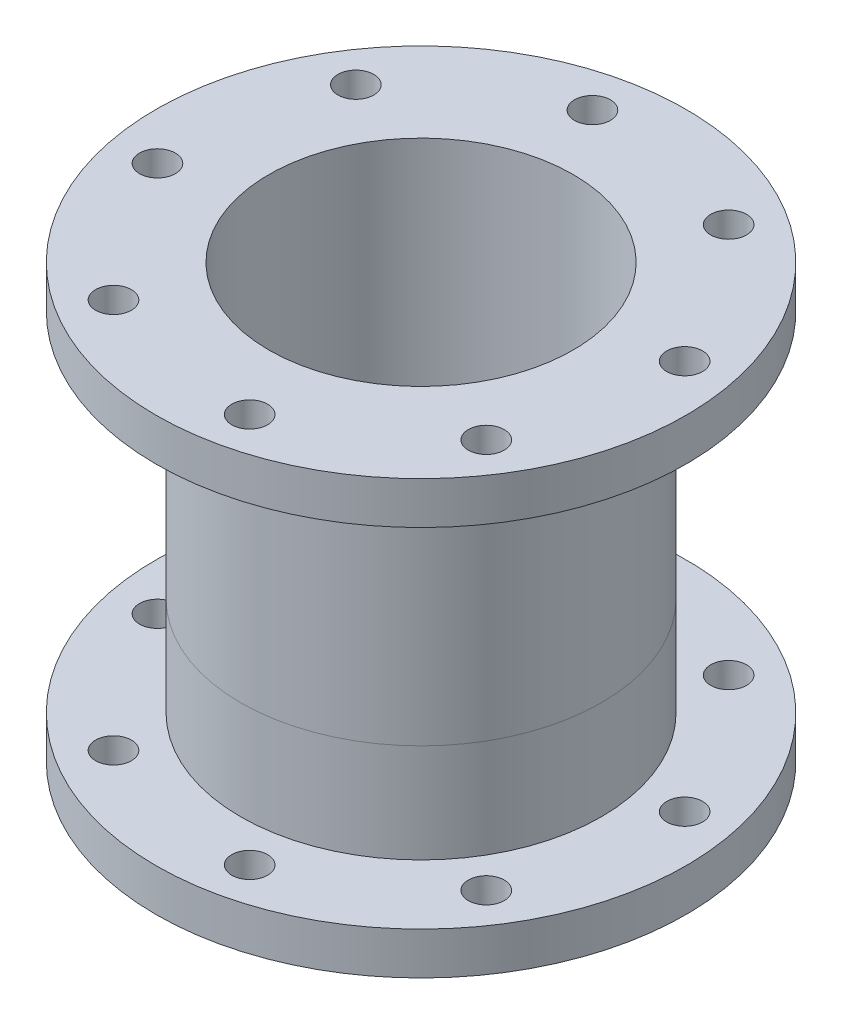
ISO-10303-21;
HEADER;
FILE_DESCRIPTION(('STEP AP214'),'2;1');
FILE_NAME('part.step','',(''),(''),'','','');
FILE_SCHEMA(('AUTOMOTIVE_DESIGN { 1 0 10303 214 1 1 1 1 }'));
ENDSEC;
DATA;
#1=APPLICATION_CONTEXT('core data for automotive mechanical design processes');
#2=APPLICATION_PROTOCOL_DEFINITION('international standard','automotive_design',2000,#1);
#3=PRODUCT_CONTEXT('',#1,'mechanical');
#4=PRODUCT('Part','Part','',(#3));
#5=PRODUCT_RELATED_PRODUCT_CATEGORY('part','',(#4));
#6=PRODUCT_DEFINITION_FORMATION('','',#4);
#7=PRODUCT_DEFINITION_CONTEXT('part definition',#1,'design');
#8=PRODUCT_DEFINITION('design','',#6,#7);
#9=PRODUCT_DEFINITION_SHAPE('','',#8);
#10=(LENGTH_UNIT() NAMED_UNIT(*) SI_UNIT(.MILLI.,.METRE.));
#11=(NAMED_UNIT(*) PLANE_ANGLE_UNIT() SI_UNIT($,.RADIAN.));
#12=(NAMED_UNIT(*) SI_UNIT($,.STERADIAN.) SOLID_ANGLE_UNIT());
#13=UNCERTAINTY_MEASURE_WITH_UNIT(LENGTH_MEASURE(1.E-05),#10,'distance_accuracy_value','');
#14=(GEOMETRIC_REPRESENTATION_CONTEXT(3) GLOBAL_UNCERTAINTY_ASSIGNED_CONTEXT((#13)) GLOBAL_UNIT_ASSIGNED_CONTEXT((#10,
#11,#12)) REPRESENTATION_CONTEXT('',''));
#15=CARTESIAN_POINT('',(0.,0.,0.));
#16=DIRECTION('',(0.,0.,1.));
#17=DIRECTION('',(1.,0.,0.));
#18=AXIS2_PLACEMENT_3D('',#15,#16,#17);
#19=CARTESIAN_POINT('',(0.,-212.944683547694,0.));
#20=DIRECTION('',(0.,1.,0.));
#21=DIRECTION('',(0.,0.,1.));
#22=AXIS2_PLACEMENT_3D('',#19,#20,#21);
#23=PLANE('',#22);
#24=CARTESIAN_POINT('',(-0.00553212594952037,-212.944683547694,0.));
#25=DIRECTION('',(0.,-1.,0.));
#26=DIRECTION('',(0.,0.,-1.));
#27=AXIS2_PLACEMENT_3D('',#24,#25,#26);
#28=CIRCLE('',#27,53.8870597874087);
#29=CARTESIAN_POINT('',(-0.00553212594952037,-212.944683547694,-53.8870597874087));
#30=VERTEX_POINT('',#29);
#31=EDGE_CURVE('E11',#30,#30,#28,.F.);
#32=ORIENTED_EDGE('',*,*,#31,.T.);
#33=EDGE_LOOP('',(#32));
#34=FACE_BOUND('',#33,.T.);
#35=CARTESIAN_POINT('',(-0.00553212594952037,-212.944683547694,0.));
#36=DIRECTION('',(0.,1.,0.));
#37=DIRECTION('',(0.,0.,1.));
#38=AXIS2_PLACEMENT_3D('',#35,#36,#37);
#39=CIRCLE('',#38,63.8870597874158);
#40=CARTESIAN_POINT('',(-0.00553212594952037,-212.944683547694,63.8870597874158));
#41=VERTEX_POINT('',#40);
#42=EDGE_CURVE('E47',#41,#41,#39,.T.);
#43=ORIENTED_EDGE('',*,*,#42,.F.);
#44=EDGE_LOOP('',(#43));
#45=FACE_BOUND('',#44,.T.);
#46=ADVANCED_FACE('F44',(#34,#45),#23,.F.);
#47=CARTESIAN_POINT('',(0.,-94.744683547694,0.));
#48=DIRECTION('',(0.,-1.,0.));
#49=DIRECTION('',(0.,0.,-1.));
#50=AXIS2_PLACEMENT_3D('',#47,#48,#49);
#51=CYLINDRICAL_SURFACE('',#50,93.8815276614418);
#52=CARTESIAN_POINT('',(0.,-124.744683547694,0.));
#53=DIRECTION('',(0.,1.,0.));
#54=DIRECTION('',(0.,0.,1.));
#55=AXIS2_PLACEMENT_3D('',#52,#53,#54);
#56=CIRCLE('',#55,93.8815276614418);
#57=CARTESIAN_POINT('',(0.,-124.744683547694,93.8815276614418));
#58=VERTEX_POINT('',#57);
#59=EDGE_CURVE('E60',#58,#58,#56,.T.);
#60=ORIENTED_EDGE('',*,*,#59,.T.);
#61=EDGE_LOOP('',(#60));
#62=FACE_BOUND('',#61,.T.);
#63=CARTESIAN_POINT('',(0.,-109.744683547694,0.));
#64=DIRECTION('',(0.,1.,0.));
#65=DIRECTION('',(0.,0.,1.));
#66=AXIS2_PLACEMENT_3D('',#63,#64,#65);
#67=CIRCLE('',#66,93.8815276614418);
#68=CARTESIAN_POINT('',(0.,-109.744683547694,93.8815276614418));
#69=VERTEX_POINT('',#68);
#70=EDGE_CURVE('E89',#69,#69,#67,.T.);
#71=ORIENTED_EDGE('',*,*,#70,.F.);
#72=EDGE_LOOP('',(#71));
#73=FACE_BOUND('',#72,.T.);
#74=ADVANCED_FACE('F138',(#62,#73),#51,.T.);
#75=CARTESIAN_POINT('',(16.3377712930376,-262.944683547694,77.0486836093337));
#76=DIRECTION('',(0.,-1.,0.));
#77=DIRECTION('',(0.,0.,-1.));
#78=AXIS2_PLACEMENT_3D('',#75,#76,#77);
#79=CYLINDRICAL_SURFACE('',#78,6.34999999999999);
#80=CARTESIAN_POINT('',(16.3377712930376,-124.744683547694,77.0486836093337));
#81=DIRECTION('',(0.,1.,0.));
#82=DIRECTION('',(0.,0.,1.));
#83=AXIS2_PLACEMENT_3D('',#80,#81,#82);
#84=CIRCLE('',#83,6.34999999999999);
#85=CARTESIAN_POINT('',(16.3377712930376,-124.744683547694,83.3986836093337));
#86=VERTEX_POINT('',#85);
#87=EDGE_CURVE('E67',#86,#86,#84,.T.);
#88=ORIENTED_EDGE('',*,*,#87,.F.);
#89=EDGE_LOOP('',(#88));
#90=FACE_BOUND('',#89,.T.);
#91=CARTESIAN_POINT('',(16.3377712930376,-109.744683547694,77.0486836093337));
#92=DIRECTION('',(0.,1.,0.));
#93=DIRECTION('',(0.,0.,1.));
#94=AXIS2_PLACEMENT_3D('',#91,#92,#93);
#95=CIRCLE('',#94,6.34999999999999);
#96=CARTESIAN_POINT('',(16.3377712930376,-109.744683547694,83.3986836093337));
#97=VERTEX_POINT('',#96);
#98=EDGE_CURVE('E95',#97,#97,#95,.F.);
#99=ORIENTED_EDGE('',*,*,#98,.F.);
#100=EDGE_LOOP('',(#99));
#101=FACE_BOUND('',#100,.T.);
#102=ADVANCED_FACE('F143',(#90,#101),#79,.F.);
#103=CARTESIAN_POINT('',(77.0486836093336,-262.944683547694,-16.3377712930379));
#104=DIRECTION('',(0.,-1.,0.));
#105=DIRECTION('',(0.,0.,-1.));
#106=AXIS2_PLACEMENT_3D('',#103,#104,#105);
#107=CYLINDRICAL_SURFACE('',#106,6.34999999999998);
#108=CARTESIAN_POINT('',(77.0486836093336,-124.744683547694,-16.3377712930379));
#109=DIRECTION('',(0.,1.,0.));
#110=DIRECTION('',(0.,0.,1.));
#111=AXIS2_PLACEMENT_3D('',#108,#109,#110);
#112=CIRCLE('',#111,6.34999999999998);
#113=CARTESIAN_POINT('',(77.0486836093336,-124.744683547694,-9.98777129303792));
#114=VERTEX_POINT('',#113);
#115=EDGE_CURVE('E73',#114,#114,#112,.T.);
#116=ORIENTED_EDGE('',*,*,#115,.F.);
#117=EDGE_LOOP('',(#116));
#118=FACE_BOUND('',#117,.T.);
#119=CARTESIAN_POINT('',(77.0486836093336,-109.744683547694,-16.3377712930379));
#120=DIRECTION('',(0.,1.,0.));
#121=DIRECTION('',(0.,0.,1.));
#122=AXIS2_PLACEMENT_3D('',#119,#120,#121);
#123=CIRCLE('',#122,6.34999999999998);
#124=CARTESIAN_POINT('',(77.0486836093336,-109.744683547694,-9.98777129303792));
#125=VERTEX_POINT('',#124);
#126=EDGE_CURVE('E101',#125,#125,#123,.F.);
#127=ORIENTED_EDGE('',*,*,#126,.F.);
#128=EDGE_LOOP('',(#127));
#129=FACE_BOUND('',#128,.T.);
#130=ADVANCED_FACE('F132',(#118,#129),#107,.F.);
#131=CARTESIAN_POINT('',(-16.3377712930382,-262.944683547694,-77.0486836093336));
#132=DIRECTION('',(0.,-1.,0.));
#133=DIRECTION('',(0.,0.,-1.));
#134=AXIS2_PLACEMENT_3D('',#131,#132,#133);
#135=CYLINDRICAL_SURFACE('',#134,6.34999999999999);
#136=CARTESIAN_POINT('',(-16.3377712930382,-124.744683547694,-77.0486836093336));
#137=DIRECTION('',(0.,1.,0.));
#138=DIRECTION('',(0.,0.,1.));
#139=AXIS2_PLACEMENT_3D('',#136,#137,#138);
#140=CIRCLE('',#139,6.34999999999999);
#141=CARTESIAN_POINT('',(-16.3377712930382,-124.744683547694,-70.6986836093336));
#142=VERTEX_POINT('',#141);
#143=EDGE_CURVE('E79',#142,#142,#140,.T.);
#144=ORIENTED_EDGE('',*,*,#143,.F.);
#145=EDGE_LOOP('',(#144));
#146=FACE_BOUND('',#145,.T.);
#147=CARTESIAN_POINT('',(-16.3377712930382,-109.744683547694,-77.0486836093336));
#148=DIRECTION('',(0.,1.,0.));
#149=DIRECTION('',(0.,0.,1.));
#150=AXIS2_PLACEMENT_3D('',#147,#148,#149);
#151=CIRCLE('',#150,6.34999999999999);
#152=CARTESIAN_POINT('',(-16.3377712930382,-109.744683547694,-70.6986836093336));
#153=VERTEX_POINT('',#152);
#154=EDGE_CURVE('E107',#153,#153,#151,.F.);
#155=ORIENTED_EDGE('',*,*,#154,.F.);
#156=EDGE_LOOP('',(#155));
#157=FACE_BOUND('',#156,.T.);
#158=ADVANCED_FACE('F122',(#146,#157),#135,.F.);
#159=CARTESIAN_POINT('',(-77.0486836093335,-262.944683547694,16.3377712930384));
#160=DIRECTION('',(0.,-1.,0.));
#161=DIRECTION('',(0.,0.,-1.));
#162=AXIS2_PLACEMENT_3D('',#159,#160,#161);
#163=CYLINDRICAL_SURFACE('',#162,6.34999999999998);
#164=CARTESIAN_POINT('',(-77.0486836093335,-124.744683547694,16.3377712930384));
#165=DIRECTION('',(0.,1.,0.));
#166=DIRECTION('',(0.,0.,1.));
#167=AXIS2_PLACEMENT_3D('',#164,#165,#166);
#168=CIRCLE('',#167,6.34999999999998);
#169=CARTESIAN_POINT('',(-77.0486836093335,-124.744683547694,22.6877712930384));
#170=VERTEX_POINT('',#169);
#171=EDGE_CURVE('E55',#170,#170,#168,.T.);
#172=ORIENTED_EDGE('',*,*,#171,.F.);
#173=EDGE_LOOP('',(#172));
#174=FACE_BOUND('',#173,.T.);
#175=CARTESIAN_POINT('',(-77.0486836093335,-109.744683547694,16.3377712930384));
#176=DIRECTION('',(0.,1.,0.));
#177=DIRECTION('',(0.,0.,1.));
#178=AXIS2_PLACEMENT_3D('',#175,#176,#177);
#179=CIRCLE('',#178,6.34999999999998);
#180=CARTESIAN_POINT('',(-77.0486836093335,-109.744683547694,22.6877712930384));
#181=VERTEX_POINT('',#180);
#182=EDGE_CURVE('E112',#181,#181,#179,.F.);
#183=ORIENTED_EDGE('',*,*,#182,.F.);
#184=EDGE_LOOP('',(#183));
#185=FACE_BOUND('',#184,.T.);
#186=ADVANCED_FACE('F119',(#174,#185),#163,.F.);
#187=CARTESIAN_POINT('',(-66.0341955324388,-262.944683547694,-42.9290977908743));
#188=DIRECTION('',(0.,-1.,0.));
#189=DIRECTION('',(0.,0.,-1.));
#190=AXIS2_PLACEMENT_3D('',#187,#188,#189);
#191=CYLINDRICAL_SURFACE('',#190,6.34999999999999);
#192=CARTESIAN_POINT('',(-66.0341955324388,-124.744683547694,-42.9290977908743));
#193=DIRECTION('',(0.,1.,0.));
#194=DIRECTION('',(0.,0.,1.));
#195=AXIS2_PLACEMENT_3D('',#192,#193,#194);
#196=CIRCLE('',#195,6.34999999999999);
#197=CARTESIAN_POINT('',(-66.0341955324388,-124.744683547694,-36.5790977908743));
#198=VERTEX_POINT('',#197);
#199=EDGE_CURVE('E82',#198,#198,#196,.T.);
#200=ORIENTED_EDGE('',*,*,#199,.F.);
#201=EDGE_LOOP('',(#200));
#202=FACE_BOUND('',#201,.T.);
#203=CARTESIAN_POINT('',(-66.0341955324388,-109.744683547694,-42.9290977908743));
#204=DIRECTION('',(0.,1.,0.));
#205=DIRECTION('',(0.,0.,1.));
#206=AXIS2_PLACEMENT_3D('',#203,#204,#205);
#207=CIRCLE('',#206,6.34999999999999);
#208=CARTESIAN_POINT('',(-66.0341955324388,-109.744683547694,-36.5790977908743));
#209=VERTEX_POINT('',#208);
#210=EDGE_CURVE('E110',#209,#209,#207,.F.);
#211=ORIENTED_EDGE('',*,*,#210,.F.);
#212=EDGE_LOOP('',(#211));
#213=FACE_BOUND('',#212,.T.);
#214=ADVANCED_FACE('F121',(#202,#213),#191,.F.);
#215=CARTESIAN_POINT('',(42.9290977908749,-262.944683547694,-66.0341955324384));
#216=DIRECTION('',(0.,-1.,0.));
#217=DIRECTION('',(0.,0.,-1.));
#218=AXIS2_PLACEMENT_3D('',#215,#216,#217);
#219=CYLINDRICAL_SURFACE('',#218,6.34999999999999);
#220=CARTESIAN_POINT('',(42.9290977908749,-124.744683547694,-66.0341955324384));
#221=DIRECTION('',(0.,1.,0.));
#222=DIRECTION('',(0.,0.,1.));
#223=AXIS2_PLACEMENT_3D('',#220,#221,#222);
#224=CIRCLE('',#223,6.34999999999999);
#225=CARTESIAN_POINT('',(42.9290977908749,-124.744683547694,-59.6841955324384));
#226=VERTEX_POINT('',#225);
#227=EDGE_CURVE('E76',#226,#226,#224,.T.);
#228=ORIENTED_EDGE('',*,*,#227,.F.);
#229=EDGE_LOOP('',(#228));
#230=FACE_BOUND('',#229,.T.);
#231=CARTESIAN_POINT('',(42.9290977908749,-109.744683547694,-66.0341955324384));
#232=DIRECTION('',(0.,1.,0.));
#233=DIRECTION('',(0.,0.,1.));
#234=AXIS2_PLACEMENT_3D('',#231,#232,#233);
#235=CIRCLE('',#234,6.34999999999999);
#236=CARTESIAN_POINT('',(42.9290977908749,-109.744683547694,-59.6841955324384));
#237=VERTEX_POINT('',#236);
#238=EDGE_CURVE('E104',#237,#237,#235,.F.);
#239=ORIENTED_EDGE('',*,*,#238,.F.);
#240=EDGE_LOOP('',(#239));
#241=FACE_BOUND('',#240,.T.);
#242=ADVANCED_FACE('F129',(#230,#241),#219,.F.);
#243=CARTESIAN_POINT('',(66.0341955324385,-262.944683547694,42.9290977908747));
#244=DIRECTION('',(0.,-1.,0.));
#245=DIRECTION('',(0.,0.,-1.));
#246=AXIS2_PLACEMENT_3D('',#243,#244,#245);
#247=CYLINDRICAL_SURFACE('',#246,6.34999999999998);
#248=CARTESIAN_POINT('',(66.0341955324385,-124.744683547694,42.9290977908747));
#249=DIRECTION('',(0.,1.,0.));
#250=DIRECTION('',(0.,0.,1.));
#251=AXIS2_PLACEMENT_3D('',#248,#249,#250);
#252=CIRCLE('',#251,6.34999999999998);
#253=CARTESIAN_POINT('',(66.0341955324385,-124.744683547694,49.2790977908747));
#254=VERTEX_POINT('',#253);
#255=EDGE_CURVE('E70',#254,#254,#252,.T.);
#256=ORIENTED_EDGE('',*,*,#255,.F.);
#257=EDGE_LOOP('',(#256));
#258=FACE_BOUND('',#257,.T.);
#259=CARTESIAN_POINT('',(66.0341955324385,-109.744683547694,42.9290977908747));
#260=DIRECTION('',(0.,1.,0.));
#261=DIRECTION('',(0.,0.,1.));
#262=AXIS2_PLACEMENT_3D('',#259,#260,#261);
#263=CIRCLE('',#262,6.34999999999998);
#264=CARTESIAN_POINT('',(66.0341955324385,-109.744683547694,49.2790977908747));
#265=VERTEX_POINT('',#264);
#266=EDGE_CURVE('E98',#265,#265,#263,.F.);
#267=ORIENTED_EDGE('',*,*,#266,.F.);
#268=EDGE_LOOP('',(#267));
#269=FACE_BOUND('',#268,.T.);
#270=ADVANCED_FACE('F166',(#258,#269),#247,.F.);
#271=CARTESIAN_POINT('',(-42.9290977908749,-262.944683547694,66.0341955324384));
#272=DIRECTION('',(0.,-1.,0.));
#273=DIRECTION('',(0.,0.,-1.));
#274=AXIS2_PLACEMENT_3D('',#271,#272,#273);
#275=CYLINDRICAL_SURFACE('',#274,6.34999999999999);
#276=CARTESIAN_POINT('',(-42.9290977908749,-124.744683547694,66.0341955324384));
#277=DIRECTION('',(0.,1.,0.));
#278=DIRECTION('',(0.,0.,1.));
#279=AXIS2_PLACEMENT_3D('',#276,#277,#278);
#280=CIRCLE('',#279,6.34999999999999);
#281=CARTESIAN_POINT('',(-42.9290977908749,-124.744683547694,72.3841955324384));
#282=VERTEX_POINT('',#281);
#283=EDGE_CURVE('E64',#282,#282,#280,.T.);
#284=ORIENTED_EDGE('',*,*,#283,.F.);
#285=EDGE_LOOP('',(#284));
#286=FACE_BOUND('',#285,.T.);
#287=CARTESIAN_POINT('',(-42.9290977908749,-109.744683547694,66.0341955324384));
#288=DIRECTION('',(0.,1.,0.));
#289=DIRECTION('',(0.,0.,1.));
#290=AXIS2_PLACEMENT_3D('',#287,#288,#289);
#291=CIRCLE('',#290,6.34999999999999);
#292=CARTESIAN_POINT('',(-42.9290977908749,-109.744683547694,72.3841955324384));
#293=VERTEX_POINT('',#292);
#294=EDGE_CURVE('E92',#293,#293,#291,.F.);
#295=ORIENTED_EDGE('',*,*,#294,.F.);
#296=EDGE_LOOP('',(#295));
#297=FACE_BOUND('',#296,.T.);
#298=ADVANCED_FACE('F159',(#286,#297),#275,.F.);
#299=CARTESIAN_POINT('',(0.,-109.744683547694,0.));
#300=DIRECTION('',(0.,1.,0.));
#301=DIRECTION('',(0.,0.,1.));
#302=AXIS2_PLACEMENT_3D('',#299,#300,#301);
#303=PLANE('',#302);
#304=CARTESIAN_POINT('',(-0.00553212594952669,-109.744683547694,0.));
#305=DIRECTION('',(0.,1.,0.));
#306=DIRECTION('',(0.,0.,1.));
#307=AXIS2_PLACEMENT_3D('',#304,#305,#306);
#308=CIRCLE('',#307,53.8870597874087);
#309=CARTESIAN_POINT('',(-0.00553212594952669,-109.744683547694,53.8870597874087));
#310=VERTEX_POINT('',#309);
#311=EDGE_CURVE('E61',#310,#310,#308,.F.);
#312=ORIENTED_EDGE('',*,*,#311,.T.);
#313=EDGE_LOOP('',(#312));
#314=FACE_BOUND('',#313,.T.);
#315=ORIENTED_EDGE('',*,*,#294,.T.);
#316=EDGE_LOOP('',(#315));
#317=FACE_BOUND('',#316,.T.);
#318=ORIENTED_EDGE('',*,*,#266,.T.);
#319=EDGE_LOOP('',(#318));
#320=FACE_BOUND('',#319,.T.);
#321=ORIENTED_EDGE('',*,*,#238,.T.);
#322=EDGE_LOOP('',(#321));
#323=FACE_BOUND('',#322,.T.);
#324=ORIENTED_EDGE('',*,*,#210,.T.);
#325=EDGE_LOOP('',(#324));
#326=FACE_BOUND('',#325,.T.);
#327=ORIENTED_EDGE('',*,*,#182,.T.);
#328=EDGE_LOOP('',(#327));
#329=FACE_BOUND('',#328,.T.);
#330=ORIENTED_EDGE('',*,*,#154,.T.);
#331=EDGE_LOOP('',(#330));
#332=FACE_BOUND('',#331,.T.);
#333=ORIENTED_EDGE('',*,*,#126,.T.);
#334=EDGE_LOOP('',(#333));
#335=FACE_BOUND('',#334,.T.);
#336=ORIENTED_EDGE('',*,*,#98,.T.);
#337=EDGE_LOOP('',(#336));
#338=FACE_BOUND('',#337,.T.);
#339=ORIENTED_EDGE('',*,*,#70,.T.);
#340=EDGE_LOOP('',(#339));
#341=FACE_BOUND('',#340,.T.);
#342=ADVANCED_FACE('F116',(#314,#317,#320,#323,#326,#329,#332,#335,#338,#341),#303,.T.);
#343=CARTESIAN_POINT('',(-0.00553212594954357,165.815985113531,0.));
#344=DIRECTION('',(0.,1.,0.));
#345=DIRECTION('',(-1.,0.,0.));
#346=AXIS2_PLACEMENT_3D('',#343,#344,#345);
#347=CYLINDRICAL_SURFACE('',#346,53.8870597874087);
#348=ORIENTED_EDGE('',*,*,#311,.F.);
#349=EDGE_LOOP('',(#348));
#350=FACE_BOUND('',#349,.T.);
#351=ORIENTED_EDGE('',*,*,#31,.F.);
#352=EDGE_LOOP('',(#351));
#353=FACE_BOUND('',#352,.T.);
#354=ADVANCED_FACE('F153',(#350,#353),#347,.F.);
#355=CARTESIAN_POINT('',(0.,-124.744683547694,0.));
#356=DIRECTION('',(0.,1.,0.));
#357=DIRECTION('',(0.,0.,1.));
#358=AXIS2_PLACEMENT_3D('',#355,#356,#357);
#359=PLANE('',#358);
#360=ORIENTED_EDGE('',*,*,#171,.T.);
#361=EDGE_LOOP('',(#360));
#362=FACE_BOUND('',#361,.T.);
#363=ORIENTED_EDGE('',*,*,#199,.T.);
#364=EDGE_LOOP('',(#363));
#365=FACE_BOUND('',#364,.T.);
#366=ORIENTED_EDGE('',*,*,#143,.T.);
#367=EDGE_LOOP('',(#366));
#368=FACE_BOUND('',#367,.T.);
#369=ORIENTED_EDGE('',*,*,#227,.T.);
#370=EDGE_LOOP('',(#369));
#371=FACE_BOUND('',#370,.T.);
#372=ORIENTED_EDGE('',*,*,#115,.T.);
#373=EDGE_LOOP('',(#372));
#374=FACE_BOUND('',#373,.T.);
#375=ORIENTED_EDGE('',*,*,#255,.T.);
#376=EDGE_LOOP('',(#375));
#377=FACE_BOUND('',#376,.T.);
#378=ORIENTED_EDGE('',*,*,#87,.T.);
#379=EDGE_LOOP('',(#378));
#380=FACE_BOUND('',#379,.T.);
#381=ORIENTED_EDGE('',*,*,#283,.T.);
#382=EDGE_LOOP('',(#381));
#383=FACE_BOUND('',#382,.T.);
#384=CARTESIAN_POINT('',(-0.00553212594952578,-124.744683547694,0.));
#385=DIRECTION('',(0.,1.,0.));
#386=DIRECTION('',(0.,0.,1.));
#387=AXIS2_PLACEMENT_3D('',#384,#385,#386);
#388=CIRCLE('',#387,63.8870597874158);
#389=CARTESIAN_POINT('',(-0.00553212594952578,-124.744683547694,63.8870597874158));
#390=VERTEX_POINT('',#389);
#391=EDGE_CURVE('E57',#390,#390,#388,.T.);
#392=ORIENTED_EDGE('',*,*,#391,.T.);
#393=EDGE_LOOP('',(#392));
#394=FACE_BOUND('',#393,.T.);
#395=ORIENTED_EDGE('',*,*,#59,.F.);
#396=EDGE_LOOP('',(#395));
#397=FACE_BOUND('',#396,.T.);
#398=ADVANCED_FACE('F148',(#362,#365,#368,#371,#374,#377,#380,#383,#394,#397),#359,.F.);
#399=CARTESIAN_POINT('',(-0.00553212594954357,165.815985113531,0.));
#400=DIRECTION('',(0.,1.,0.));
#401=DIRECTION('',(-1.,0.,0.));
#402=AXIS2_PLACEMENT_3D('',#399,#400,#401);
#403=CYLINDRICAL_SURFACE('',#402,63.8870597874158);
#404=ORIENTED_EDGE('',*,*,#42,.T.);
#405=EDGE_LOOP('',(#404));
#406=FACE_BOUND('',#405,.T.);
#407=ORIENTED_EDGE('',*,*,#391,.F.);
#408=EDGE_LOOP('',(#407));
#409=FACE_BOUND('',#408,.T.);
#410=ADVANCED_FACE('F139',(#406,#409),#403,.T.);
#411=CLOSED_SHELL('',(#46,#74,#102,#130,#158,#186,#214,#242,#270,#298,#342,#354,#398,#410));
#412=MANIFOLD_SOLID_BREP('B2',#411);
#413=CARTESIAN_POINT('',(0.,-212.944683547694,0.));
#414=DIRECTION('',(0.,1.,0.));
#415=DIRECTION('',(0.,0.,1.));
#416=AXIS2_PLACEMENT_3D('',#413,#414,#415);
#417=PLANE('',#416);
#418=CARTESIAN_POINT('',(-0.00553212594952037,-212.944683547694,0.));
#419=DIRECTION('',(0.,1.,0.));
#420=DIRECTION('',(0.,0.,1.));
#421=AXIS2_PLACEMENT_3D('',#418,#419,#420);
#422=CIRCLE('',#421,63.8870597874158);
#423=CARTESIAN_POINT('',(-0.00553212594952037,-212.944683547694,63.8870597874158));
#424=VERTEX_POINT('',#423);
#425=EDGE_CURVE('E307',#424,#424,#422,.T.);
#426=ORIENTED_EDGE('',*,*,#425,.T.);
#427=EDGE_LOOP('',(#426));
#428=FACE_BOUND('',#427,.T.);
#429=ADVANCED_FACE('F303',(#428),#417,.T.);
#430=CARTESIAN_POINT('',(-0.00553212594954357,165.815985113531,0.));
#431=DIRECTION('',(0.,1.,0.));
#432=DIRECTION('',(-1.,0.,0.));
#433=AXIS2_PLACEMENT_3D('',#430,#431,#432);
#434=CYLINDRICAL_SURFACE('',#433,63.8870597874158);
#435=CARTESIAN_POINT('',(-0.00553212594951823,-247.944683547694,0.));
#436=DIRECTION('',(0.,1.,0.));
#437=DIRECTION('',(0.,0.,1.));
#438=AXIS2_PLACEMENT_3D('',#435,#436,#437);
#439=CIRCLE('',#438,63.8870597874158);
#440=CARTESIAN_POINT('',(-0.00553212594951823,-247.944683547694,63.8870597874158));
#441=VERTEX_POINT('',#440);
#442=EDGE_CURVE('E43',#441,#441,#439,.T.);
#443=ORIENTED_EDGE('',*,*,#442,.T.);
#444=EDGE_LOOP('',(#443));
#445=FACE_BOUND('',#444,.T.);
#446=ORIENTED_EDGE('',*,*,#425,.F.);
#447=EDGE_LOOP('',(#446));
#448=FACE_BOUND('',#447,.T.);
#449=ADVANCED_FACE('F305',(#445,#448),#434,.T.);
#450=CARTESIAN_POINT('',(0.,-262.944683547694,0.));
#451=DIRECTION('',(0.,1.,0.));
#452=DIRECTION('',(0.,0.,1.));
#453=AXIS2_PLACEMENT_3D('',#450,#451,#452);
#454=PLANE('',#453);
#455=CARTESIAN_POINT('',(-77.0486836093335,-262.944683547694,16.3377712930384));
#456=DIRECTION('',(0.,-1.,0.));
#457=DIRECTION('',(0.,0.,-1.));
#458=AXIS2_PLACEMENT_3D('',#455,#456,#457);
#459=CIRCLE('',#458,6.34999999999999);
#460=CARTESIAN_POINT('',(-77.0486836093335,-262.944683547694,9.98777129303844));
#461=VERTEX_POINT('',#460);
#462=EDGE_CURVE('E383',#461,#461,#459,.T.);
#463=ORIENTED_EDGE('',*,*,#462,.F.);
#464=EDGE_LOOP('',(#463));
#465=FACE_BOUND('',#464,.T.);
#466=CARTESIAN_POINT('',(-16.3377712930382,-262.944683547694,-77.0486836093336));
#467=DIRECTION('',(0.,-1.,0.));
#468=DIRECTION('',(0.,0.,-1.));
#469=AXIS2_PLACEMENT_3D('',#466,#467,#468);
#470=CIRCLE('',#469,6.35);
#471=CARTESIAN_POINT('',(-16.3377712930382,-262.944683547694,-83.3986836093336));
#472=VERTEX_POINT('',#471);
#473=EDGE_CURVE('E367',#472,#472,#470,.T.);
#474=ORIENTED_EDGE('',*,*,#473,.F.);
#475=EDGE_LOOP('',(#474));
#476=FACE_BOUND('',#475,.T.);
#477=CARTESIAN_POINT('',(77.0486836093336,-262.944683547694,-16.3377712930379));
#478=DIRECTION('',(0.,-1.,0.));
#479=DIRECTION('',(0.,0.,-1.));
#480=AXIS2_PLACEMENT_3D('',#477,#478,#479);
#481=CIRCLE('',#480,6.34999999999999);
#482=CARTESIAN_POINT('',(77.0486836093336,-262.944683547694,-22.6877712930379));
#483=VERTEX_POINT('',#482);
#484=EDGE_CURVE('E351',#483,#483,#481,.T.);
#485=ORIENTED_EDGE('',*,*,#484,.F.);
#486=EDGE_LOOP('',(#485));
#487=FACE_BOUND('',#486,.T.);
#488=CARTESIAN_POINT('',(16.3377712930376,-262.944683547694,77.0486836093337));
#489=DIRECTION('',(0.,-1.,0.));
#490=DIRECTION('',(0.,0.,-1.));
#491=AXIS2_PLACEMENT_3D('',#488,#489,#490);
#492=CIRCLE('',#491,6.35);
#493=CARTESIAN_POINT('',(16.3377712930376,-262.944683547694,70.6986836093337));
#494=VERTEX_POINT('',#493);
#495=EDGE_CURVE('E335',#494,#494,#492,.T.);
#496=ORIENTED_EDGE('',*,*,#495,.F.);
#497=EDGE_LOOP('',(#496));
#498=FACE_BOUND('',#497,.T.);
#499=CARTESIAN_POINT('',(-42.9290977908749,-262.944683547694,66.0341955324384));
#500=DIRECTION('',(0.,-1.,0.));
#501=DIRECTION('',(0.,0.,-1.));
#502=AXIS2_PLACEMENT_3D('',#499,#500,#501);
#503=CIRCLE('',#502,6.35);
#504=CARTESIAN_POINT('',(-42.9290977908749,-262.944683547694,59.6841955324384));
#505=VERTEX_POINT('',#504);
#506=EDGE_CURVE('E327',#505,#505,#503,.T.);
#507=ORIENTED_EDGE('',*,*,#506,.F.);
#508=EDGE_LOOP('',(#507));
#509=FACE_BOUND('',#508,.T.);
#510=CARTESIAN_POINT('',(0.,-262.944683547694,0.));
#511=DIRECTION('',(0.,1.,0.));
#512=DIRECTION('',(0.,0.,1.));
#513=AXIS2_PLACEMENT_3D('',#510,#511,#512);
#514=CIRCLE('',#513,93.8815276614418);
#515=CARTESIAN_POINT('',(0.,-262.944683547694,93.8815276614418));
#516=VERTEX_POINT('',#515);
#517=EDGE_CURVE('E317',#516,#516,#514,.T.);
#518=ORIENTED_EDGE('',*,*,#517,.F.);
#519=EDGE_LOOP('',(#518));
#520=FACE_BOUND('',#519,.T.);
#521=CARTESIAN_POINT('',(66.0341955324385,-262.944683547694,42.9290977908747));
#522=DIRECTION('',(0.,-1.,0.));
#523=DIRECTION('',(0.,0.,-1.));
#524=AXIS2_PLACEMENT_3D('',#521,#522,#523);
#525=CIRCLE('',#524,6.34999999999999);
#526=CARTESIAN_POINT('',(66.0341955324385,-262.944683547694,36.5790977908747));
#527=VERTEX_POINT('',#526);
#528=EDGE_CURVE('E343',#527,#527,#525,.T.);
#529=ORIENTED_EDGE('',*,*,#528,.F.);
#530=EDGE_LOOP('',(#529));
#531=FACE_BOUND('',#530,.T.);
#532=CARTESIAN_POINT('',(42.9290977908749,-262.944683547694,-66.0341955324384));
#533=DIRECTION('',(0.,-1.,0.));
#534=DIRECTION('',(0.,0.,-1.));
#535=AXIS2_PLACEMENT_3D('',#532,#533,#534);
#536=CIRCLE('',#535,6.35);
#537=CARTESIAN_POINT('',(42.9290977908749,-262.944683547694,-72.3841955324384));
#538=VERTEX_POINT('',#537);
#539=EDGE_CURVE('E359',#538,#538,#536,.T.);
#540=ORIENTED_EDGE('',*,*,#539,.F.);
#541=EDGE_LOOP('',(#540));
#542=FACE_BOUND('',#541,.T.);
#543=CARTESIAN_POINT('',(-66.0341955324388,-262.944683547694,-42.9290977908743));
#544=DIRECTION('',(0.,-1.,0.));
#545=DIRECTION('',(0.,0.,-1.));
#546=AXIS2_PLACEMENT_3D('',#543,#544,#545);
#547=CIRCLE('',#546,6.35);
#548=CARTESIAN_POINT('',(-66.0341955324388,-262.944683547694,-49.2790977908743));
#549=VERTEX_POINT('',#548);
#550=EDGE_CURVE('E375',#549,#549,#547,.T.);
#551=ORIENTED_EDGE('',*,*,#550,.F.);
#552=EDGE_LOOP('',(#551));
#553=FACE_BOUND('',#552,.T.);
#554=ADVANCED_FACE('F394',(#465,#476,#487,#498,#509,#520,#531,#542,#553),#454,.F.);
#555=CARTESIAN_POINT('',(0.,-247.944683547694,0.));
#556=DIRECTION('',(0.,1.,0.));
#557=DIRECTION('',(0.,0.,1.));
#558=AXIS2_PLACEMENT_3D('',#555,#556,#557);
#559=PLANE('',#558);
#560=CARTESIAN_POINT('',(-77.0486836093335,-247.944683547694,16.3377712930384));
#561=DIRECTION('',(0.,1.,0.));
#562=DIRECTION('',(0.,0.,1.));
#563=AXIS2_PLACEMENT_3D('',#560,#561,#562);
#564=CIRCLE('',#563,6.34999999999998);
#565=CARTESIAN_POINT('',(-77.0486836093335,-247.944683547694,22.6877712930384));
#566=VERTEX_POINT('',#565);
#567=EDGE_CURVE('E379',#566,#566,#564,.T.);
#568=ORIENTED_EDGE('',*,*,#567,.F.);
#569=EDGE_LOOP('',(#568));
#570=FACE_BOUND('',#569,.T.);
#571=CARTESIAN_POINT('',(-66.0341955324388,-247.944683547694,-42.9290977908743));
#572=DIRECTION('',(0.,1.,0.));
#573=DIRECTION('',(0.,0.,1.));
#574=AXIS2_PLACEMENT_3D('',#571,#572,#573);
#575=CIRCLE('',#574,6.34999999999999);
#576=CARTESIAN_POINT('',(-66.0341955324388,-247.944683547694,-36.5790977908743));
#577=VERTEX_POINT('',#576);
#578=EDGE_CURVE('E371',#577,#577,#575,.T.);
#579=ORIENTED_EDGE('',*,*,#578,.F.);
#580=EDGE_LOOP('',(#579));
#581=FACE_BOUND('',#580,.T.);
#582=CARTESIAN_POINT('',(-16.3377712930382,-247.944683547694,-77.0486836093336));
#583=DIRECTION('',(0.,1.,0.));
#584=DIRECTION('',(0.,0.,1.));
#585=AXIS2_PLACEMENT_3D('',#582,#583,#584);
#586=CIRCLE('',#585,6.34999999999999);
#587=CARTESIAN_POINT('',(-16.3377712930382,-247.944683547694,-70.6986836093336));
#588=VERTEX_POINT('',#587);
#589=EDGE_CURVE('E363',#588,#588,#586,.T.);
#590=ORIENTED_EDGE('',*,*,#589,.F.);
#591=EDGE_LOOP('',(#590));
#592=FACE_BOUND('',#591,.T.);
#593=CARTESIAN_POINT('',(42.9290977908749,-247.944683547694,-66.0341955324384));
#594=DIRECTION('',(0.,1.,0.));
#595=DIRECTION('',(0.,0.,1.));
#596=AXIS2_PLACEMENT_3D('',#593,#594,#595);
#597=CIRCLE('',#596,6.34999999999999);
#598=CARTESIAN_POINT('',(42.9290977908749,-247.944683547694,-59.6841955324384));
#599=VERTEX_POINT('',#598);
#600=EDGE_CURVE('E355',#599,#599,#597,.T.);
#601=ORIENTED_EDGE('',*,*,#600,.F.);
#602=EDGE_LOOP('',(#601));
#603=FACE_BOUND('',#602,.T.);
#604=CARTESIAN_POINT('',(77.0486836093336,-247.944683547694,-16.3377712930379));
#605=DIRECTION('',(0.,1.,0.));
#606=DIRECTION('',(0.,0.,1.));
#607=AXIS2_PLACEMENT_3D('',#604,#605,#606);
#608=CIRCLE('',#607,6.34999999999998);
#609=CARTESIAN_POINT('',(77.0486836093336,-247.944683547694,-9.98777129303792));
#610=VERTEX_POINT('',#609);
#611=EDGE_CURVE('E347',#610,#610,#608,.T.);
#612=ORIENTED_EDGE('',*,*,#611,.F.);
#613=EDGE_LOOP('',(#612));
#614=FACE_BOUND('',#613,.T.);
#615=CARTESIAN_POINT('',(66.0341955324385,-247.944683547694,42.9290977908747));
#616=DIRECTION('',(0.,1.,0.));
#617=DIRECTION('',(0.,0.,1.));
#618=AXIS2_PLACEMENT_3D('',#615,#616,#617);
#619=CIRCLE('',#618,6.34999999999998);
#620=CARTESIAN_POINT('',(66.0341955324385,-247.944683547694,49.2790977908747));
#621=VERTEX_POINT('',#620);
#622=EDGE_CURVE('E339',#621,#621,#619,.T.);
#623=ORIENTED_EDGE('',*,*,#622,.F.);
#624=EDGE_LOOP('',(#623));
#625=FACE_BOUND('',#624,.T.);
#626=CARTESIAN_POINT('',(16.3377712930376,-247.944683547694,77.0486836093337));
#627=DIRECTION('',(0.,1.,0.));
#628=DIRECTION('',(0.,0.,1.));
#629=AXIS2_PLACEMENT_3D('',#626,#627,#628);
#630=CIRCLE('',#629,6.34999999999999);
#631=CARTESIAN_POINT('',(16.3377712930376,-247.944683547694,83.3986836093337));
#632=VERTEX_POINT('',#631);
#633=EDGE_CURVE('E331',#632,#632,#630,.T.);
#634=ORIENTED_EDGE('',*,*,#633,.F.);
#635=EDGE_LOOP('',(#634));
#636=FACE_BOUND('',#635,.T.);
#637=CARTESIAN_POINT('',(-42.9290977908749,-247.944683547694,66.0341955324384));
#638=DIRECTION('',(0.,1.,0.));
#639=DIRECTION('',(0.,0.,1.));
#640=AXIS2_PLACEMENT_3D('',#637,#638,#639);
#641=CIRCLE('',#640,6.34999999999999);
#642=CARTESIAN_POINT('',(-42.9290977908749,-247.944683547694,72.3841955324384));
#643=VERTEX_POINT('',#642);
#644=EDGE_CURVE('E322',#643,#643,#641,.T.);
#645=ORIENTED_EDGE('',*,*,#644,.F.);
#646=EDGE_LOOP('',(#645));
#647=FACE_BOUND('',#646,.T.);
#648=ORIENTED_EDGE('',*,*,#442,.F.);
#649=EDGE_LOOP('',(#648));
#650=FACE_BOUND('',#649,.T.);
#651=CARTESIAN_POINT('',(0.,-247.944683547694,0.));
#652=DIRECTION('',(0.,1.,0.));
#653=DIRECTION('',(0.,0.,1.));
#654=AXIS2_PLACEMENT_3D('',#651,#652,#653);
#655=CIRCLE('',#654,93.8815276614418);
#656=CARTESIAN_POINT('',(0.,-247.944683547694,93.8815276614418));
#657=VERTEX_POINT('',#656);
#658=EDGE_CURVE('E312',#657,#657,#655,.T.);
#659=ORIENTED_EDGE('',*,*,#658,.T.);
#660=EDGE_LOOP('',(#659));
#661=FACE_BOUND('',#660,.T.);
#662=ADVANCED_FACE('F399',(#570,#581,#592,#603,#614,#625,#636,#647,#650,#661),#559,.T.);
#663=CARTESIAN_POINT('',(0.,-247.944683547694,0.));
#664=DIRECTION('',(0.,-1.,0.));
#665=DIRECTION('',(0.,0.,-1.));
#666=AXIS2_PLACEMENT_3D('',#663,#664,#665);
#667=CYLINDRICAL_SURFACE('',#666,93.8815276614418);
#668=ORIENTED_EDGE('',*,*,#658,.F.);
#669=EDGE_LOOP('',(#668));
#670=FACE_BOUND('',#669,.T.);
#671=ORIENTED_EDGE('',*,*,#517,.T.);
#672=EDGE_LOOP('',(#671));
#673=FACE_BOUND('',#672,.T.);
#674=ADVANCED_FACE('F432',(#670,#673),#667,.T.);
#675=CARTESIAN_POINT('',(-42.9290977908749,-262.944683547694,66.0341955324384));
#676=DIRECTION('',(0.,-1.,0.));
#677=DIRECTION('',(0.,0.,-1.));
#678=AXIS2_PLACEMENT_3D('',#675,#676,#677);
#679=CYLINDRICAL_SURFACE('',#678,6.34999999999999);
#680=ORIENTED_EDGE('',*,*,#644,.T.);
#681=EDGE_LOOP('',(#680));
#682=FACE_BOUND('',#681,.T.);
#683=ORIENTED_EDGE('',*,*,#506,.T.);
#684=EDGE_LOOP('',(#683));
#685=FACE_BOUND('',#684,.T.);
#686=ADVANCED_FACE('F430',(#682,#685),#679,.F.);
#687=CARTESIAN_POINT('',(16.3377712930376,-262.944683547694,77.0486836093337));
#688=DIRECTION('',(0.,-1.,0.));
#689=DIRECTION('',(0.,0.,-1.));
#690=AXIS2_PLACEMENT_3D('',#687,#688,#689);
#691=CYLINDRICAL_SURFACE('',#690,6.34999999999999);
#692=ORIENTED_EDGE('',*,*,#633,.T.);
#693=EDGE_LOOP('',(#692));
#694=FACE_BOUND('',#693,.T.);
#695=ORIENTED_EDGE('',*,*,#495,.T.);
#696=EDGE_LOOP('',(#695));
#697=FACE_BOUND('',#696,.T.);
#698=ADVANCED_FACE('F428',(#694,#697),#691,.F.);
#699=CARTESIAN_POINT('',(66.0341955324385,-262.944683547694,42.9290977908747));
#700=DIRECTION('',(0.,-1.,0.));
#701=DIRECTION('',(0.,0.,-1.));
#702=AXIS2_PLACEMENT_3D('',#699,#700,#701);
#703=CYLINDRICAL_SURFACE('',#702,6.34999999999998);
#704=ORIENTED_EDGE('',*,*,#622,.T.);
#705=EDGE_LOOP('',(#704));
#706=FACE_BOUND('',#705,.T.);
#707=ORIENTED_EDGE('',*,*,#528,.T.);
#708=EDGE_LOOP('',(#707));
#709=FACE_BOUND('',#708,.T.);
#710=ADVANCED_FACE('F426',(#706,#709),#703,.F.);
#711=CARTESIAN_POINT('',(77.0486836093336,-262.944683547694,-16.3377712930379));
#712=DIRECTION('',(0.,-1.,0.));
#713=DIRECTION('',(0.,0.,-1.));
#714=AXIS2_PLACEMENT_3D('',#711,#712,#713);
#715=CYLINDRICAL_SURFACE('',#714,6.34999999999998);
#716=ORIENTED_EDGE('',*,*,#611,.T.);
#717=EDGE_LOOP('',(#716));
#718=FACE_BOUND('',#717,.T.);
#719=ORIENTED_EDGE('',*,*,#484,.T.);
#720=EDGE_LOOP('',(#719));
#721=FACE_BOUND('',#720,.T.);
#722=ADVANCED_FACE('F424',(#718,#721),#715,.F.);
#723=CARTESIAN_POINT('',(42.9290977908749,-262.944683547694,-66.0341955324384));
#724=DIRECTION('',(0.,-1.,0.));
#725=DIRECTION('',(0.,0.,-1.));
#726=AXIS2_PLACEMENT_3D('',#723,#724,#725);
#727=CYLINDRICAL_SURFACE('',#726,6.34999999999999);
#728=ORIENTED_EDGE('',*,*,#600,.T.);
#729=EDGE_LOOP('',(#728));
#730=FACE_BOUND('',#729,.T.);
#731=ORIENTED_EDGE('',*,*,#539,.T.);
#732=EDGE_LOOP('',(#731));
#733=FACE_BOUND('',#732,.T.);
#734=ADVANCED_FACE('F421',(#730,#733),#727,.F.);
#735=CARTESIAN_POINT('',(-16.3377712930382,-262.944683547694,-77.0486836093336));
#736=DIRECTION('',(0.,-1.,0.));
#737=DIRECTION('',(0.,0.,-1.));
#738=AXIS2_PLACEMENT_3D('',#735,#736,#737);
#739=CYLINDRICAL_SURFACE('',#738,6.34999999999999);
#740=ORIENTED_EDGE('',*,*,#589,.T.);
#741=EDGE_LOOP('',(#740));
#742=FACE_BOUND('',#741,.T.);
#743=ORIENTED_EDGE('',*,*,#473,.T.);
#744=EDGE_LOOP('',(#743));
#745=FACE_BOUND('',#744,.T.);
#746=ADVANCED_FACE('F415',(#742,#745),#739,.F.);
#747=CARTESIAN_POINT('',(-66.0341955324388,-262.944683547694,-42.9290977908743));
#748=DIRECTION('',(0.,-1.,0.));
#749=DIRECTION('',(0.,0.,-1.));
#750=AXIS2_PLACEMENT_3D('',#747,#748,#749);
#751=CYLINDRICAL_SURFACE('',#750,6.34999999999999);
#752=ORIENTED_EDGE('',*,*,#578,.T.);
#753=EDGE_LOOP('',(#752));
#754=FACE_BOUND('',#753,.T.);
#755=ORIENTED_EDGE('',*,*,#550,.T.);
#756=EDGE_LOOP('',(#755));
#757=FACE_BOUND('',#756,.T.);
#758=ADVANCED_FACE('F409',(#754,#757),#751,.F.);
#759=CARTESIAN_POINT('',(-77.0486836093335,-262.944683547694,16.3377712930384));
#760=DIRECTION('',(0.,-1.,0.));
#761=DIRECTION('',(0.,0.,-1.));
#762=AXIS2_PLACEMENT_3D('',#759,#760,#761);
#763=CYLINDRICAL_SURFACE('',#762,6.34999999999998);
#764=ORIENTED_EDGE('',*,*,#567,.T.);
#765=EDGE_LOOP('',(#764));
#766=FACE_BOUND('',#765,.T.);
#767=ORIENTED_EDGE('',*,*,#462,.T.);
#768=EDGE_LOOP('',(#767));
#769=FACE_BOUND('',#768,.T.);
#770=ADVANCED_FACE('F403',(#766,#769),#763,.F.);
#771=CLOSED_SHELL('',(#429,#449,#554,#662,#674,#686,#698,#710,#722,#734,#746,#758,#770));
#772=MANIFOLD_SOLID_BREP('B6',#771);
#773=ADVANCED_BREP_SHAPE_REPRESENTATION('',(#18,#412,#772),#14);
#774=SHAPE_DEFINITION_REPRESENTATION(#9,#773);
ENDSEC;
END-ISO-10303-21;
